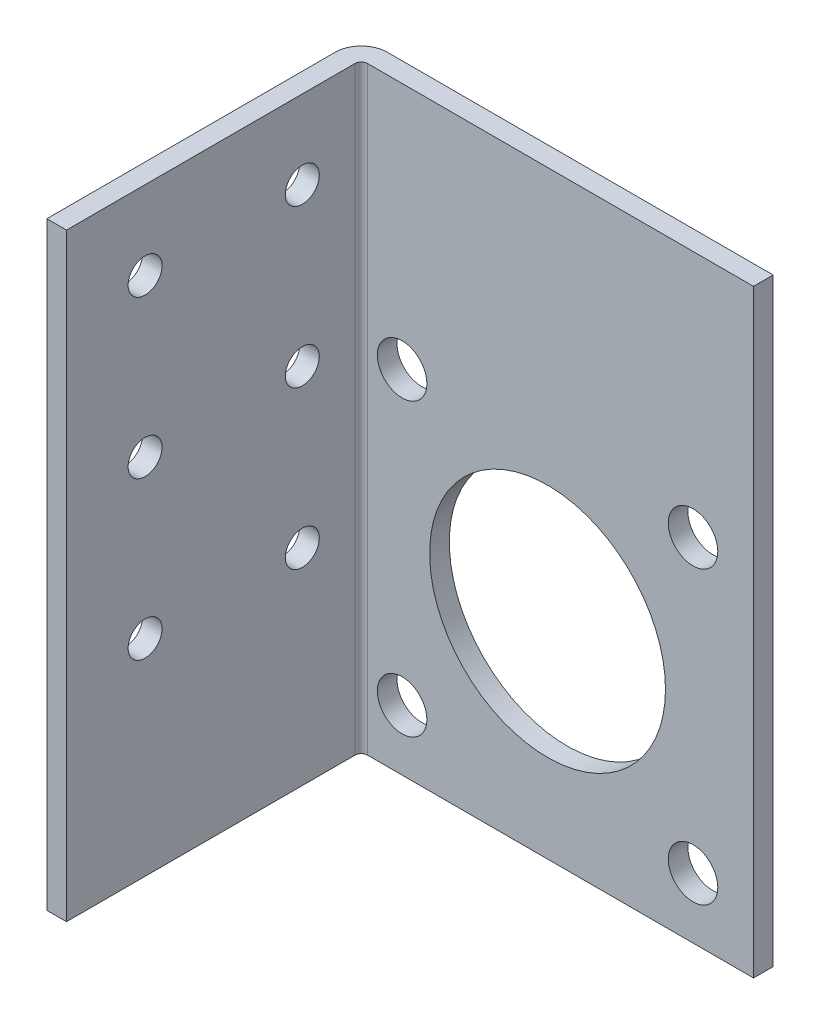
ISO-10303-21;
HEADER;
FILE_DESCRIPTION(('STEP AP214'),'2;1');
FILE_NAME('part.step','',(''),(''),'','','');
FILE_SCHEMA(('AUTOMOTIVE_DESIGN { 1 0 10303 214 1 1 1 1 }'));
ENDSEC;
DATA;
#1=APPLICATION_CONTEXT('core data for automotive mechanical design processes');
#2=APPLICATION_PROTOCOL_DEFINITION('international standard','automotive_design',2000,#1);
#3=PRODUCT_CONTEXT('',#1,'mechanical');
#4=PRODUCT('Part','Part','',(#3));
#5=PRODUCT_RELATED_PRODUCT_CATEGORY('part','',(#4));
#6=PRODUCT_DEFINITION_FORMATION('','',#4);
#7=PRODUCT_DEFINITION_CONTEXT('part definition',#1,'design');
#8=PRODUCT_DEFINITION('design','',#6,#7);
#9=PRODUCT_DEFINITION_SHAPE('','',#8);
#10=(LENGTH_UNIT() NAMED_UNIT(*) SI_UNIT(.MILLI.,.METRE.));
#11=(NAMED_UNIT(*) PLANE_ANGLE_UNIT() SI_UNIT($,.RADIAN.));
#12=(NAMED_UNIT(*) SI_UNIT($,.STERADIAN.) SOLID_ANGLE_UNIT());
#13=UNCERTAINTY_MEASURE_WITH_UNIT(LENGTH_MEASURE(1.E-05),#10,'distance_accuracy_value','');
#14=(GEOMETRIC_REPRESENTATION_CONTEXT(3) GLOBAL_UNCERTAINTY_ASSIGNED_CONTEXT((#13)) GLOBAL_UNIT_ASSIGNED_CONTEXT((#10,
#11,#12)) REPRESENTATION_CONTEXT('',''));
#15=CARTESIAN_POINT('',(0.,0.,0.));
#16=DIRECTION('',(0.,0.,1.));
#17=DIRECTION('',(1.,0.,0.));
#18=AXIS2_PLACEMENT_3D('',#15,#16,#17);
#19=CARTESIAN_POINT('',(0.,0.,3.175));
#20=DIRECTION('',(0.,0.,-1.));
#21=DIRECTION('',(-1.,0.,0.));
#22=AXIS2_PLACEMENT_3D('',#19,#20,#21);
#23=PLANE('',#22);
#24=CARTESIAN_POINT('',(-23.5,23.5,3.175));
#25=DIRECTION('',(0.,0.,1.));
#26=DIRECTION('',(1.,0.,0.));
#27=AXIS2_PLACEMENT_3D('',#24,#25,#26);
#28=CIRCLE('',#27,4.);
#29=CARTESIAN_POINT('',(-19.5,23.5,3.175));
#30=VERTEX_POINT('',#29);
#31=EDGE_CURVE('E129',#30,#30,#28,.T.);
#32=ORIENTED_EDGE('',*,*,#31,.F.);
#33=EDGE_LOOP('',(#32));
#34=FACE_BOUND('',#33,.T.);
#35=CARTESIAN_POINT('',(-23.5,-23.5,3.175));
#36=DIRECTION('',(0.,0.,1.));
#37=DIRECTION('',(1.,0.,0.));
#38=AXIS2_PLACEMENT_3D('',#35,#36,#37);
#39=CIRCLE('',#38,4.);
#40=CARTESIAN_POINT('',(-19.5,-23.5,3.175));
#41=VERTEX_POINT('',#40);
#42=EDGE_CURVE('E135',#41,#41,#39,.T.);
#43=ORIENTED_EDGE('',*,*,#42,.F.);
#44=EDGE_LOOP('',(#43));
#45=FACE_BOUND('',#44,.T.);
#46=CARTESIAN_POINT('',(23.5,-23.5,3.175));
#47=DIRECTION('',(0.,0.,1.));
#48=DIRECTION('',(1.,0.,0.));
#49=AXIS2_PLACEMENT_3D('',#46,#47,#48);
#50=CIRCLE('',#49,4.);
#51=CARTESIAN_POINT('',(27.5,-23.5,3.175));
#52=VERTEX_POINT('',#51);
#53=EDGE_CURVE('E141',#52,#52,#50,.T.);
#54=ORIENTED_EDGE('',*,*,#53,.F.);
#55=EDGE_LOOP('',(#54));
#56=FACE_BOUND('',#55,.T.);
#57=CARTESIAN_POINT('',(23.5,23.5,3.175));
#58=DIRECTION('',(0.,0.,1.));
#59=DIRECTION('',(1.,0.,0.));
#60=AXIS2_PLACEMENT_3D('',#57,#58,#59);
#61=CIRCLE('',#60,4.);
#62=CARTESIAN_POINT('',(27.5,23.5,3.175));
#63=VERTEX_POINT('',#62);
#64=EDGE_CURVE('E147',#63,#63,#61,.T.);
#65=ORIENTED_EDGE('',*,*,#64,.F.);
#66=EDGE_LOOP('',(#65));
#67=FACE_BOUND('',#66,.T.);
#68=CARTESIAN_POINT('',(0.,0.,3.175));
#69=DIRECTION('',(0.,0.,1.));
#70=DIRECTION('',(1.,0.,0.));
#71=AXIS2_PLACEMENT_3D('',#68,#69,#70);
#72=CIRCLE('',#71,19.05);
#73=CARTESIAN_POINT('',(19.05,0.,3.175));
#74=VERTEX_POINT('',#73);
#75=EDGE_CURVE('E153',#74,#74,#72,.T.);
#76=ORIENTED_EDGE('',*,*,#75,.F.);
#77=EDGE_LOOP('',(#76));
#78=FACE_BOUND('',#77,.T.);
#79=DIRECTION('',(-1.,0.,0.));
#80=VECTOR('',#79,1.);
#81=CARTESIAN_POINT('',(-33.274,63.5,3.175));
#82=LINE('',#81,#80);
#83=CARTESIAN_POINT('',(33.274,63.5,3.175));
#84=VERTEX_POINT('',#83);
#85=CARTESIAN_POINT('',(-29.083,63.5,3.175));
#86=VERTEX_POINT('',#85);
#87=EDGE_CURVE('E159',#84,#86,#82,.T.);
#88=ORIENTED_EDGE('',*,*,#87,.T.);
#89=DIRECTION('',(0.,1.,0.));
#90=VECTOR('',#89,1.);
#91=CARTESIAN_POINT('',(-29.083,-33.274,3.175));
#92=LINE('',#91,#90);
#93=CARTESIAN_POINT('',(-29.083,-33.274,3.175));
#94=VERTEX_POINT('',#93);
#95=EDGE_CURVE('E184',#86,#94,#92,.F.);
#96=ORIENTED_EDGE('',*,*,#95,.T.);
#97=DIRECTION('',(1.,0.,0.));
#98=VECTOR('',#97,1.);
#99=CARTESIAN_POINT('',(33.274,-33.274,3.175));
#100=LINE('',#99,#98);
#101=CARTESIAN_POINT('',(33.274,-33.274,3.175));
#102=VERTEX_POINT('',#101);
#103=EDGE_CURVE('E162',#94,#102,#100,.T.);
#104=ORIENTED_EDGE('',*,*,#103,.T.);
#105=DIRECTION('',(0.,1.,0.));
#106=VECTOR('',#105,1.);
#107=CARTESIAN_POINT('',(33.274,63.5,3.175));
#108=LINE('',#107,#106);
#109=EDGE_CURVE('E165',#102,#84,#108,.T.);
#110=ORIENTED_EDGE('',*,*,#109,.T.);
#111=EDGE_LOOP('',(#88,#96,#104,#110));
#112=FACE_BOUND('',#111,.T.);
#113=ADVANCED_FACE('F32',(#34,#45,#56,#67,#78,#112),#23,.F.);
#114=CARTESIAN_POINT('',(0.,0.,0.));
#115=DIRECTION('',(0.,0.,-1.));
#116=DIRECTION('',(-1.,0.,0.));
#117=AXIS2_PLACEMENT_3D('',#114,#115,#116);
#118=PLANE('',#117);
#119=DIRECTION('',(1.,0.,0.));
#120=VECTOR('',#119,1.);
#121=CARTESIAN_POINT('',(33.274,-33.274,0.));
#122=LINE('',#121,#120);
#123=CARTESIAN_POINT('',(-29.083,-33.274,0.));
#124=VERTEX_POINT('',#123);
#125=CARTESIAN_POINT('',(33.274,-33.274,0.));
#126=VERTEX_POINT('',#125);
#127=EDGE_CURVE('E169',#124,#126,#122,.T.);
#128=ORIENTED_EDGE('',*,*,#127,.F.);
#129=DIRECTION('',(0.,-1.,0.));
#130=VECTOR('',#129,1.);
#131=CARTESIAN_POINT('',(-29.083,63.5,0.));
#132=LINE('',#131,#130);
#133=CARTESIAN_POINT('',(-29.083,63.5,0.));
#134=VERTEX_POINT('',#133);
#135=EDGE_CURVE('E40',#124,#134,#132,.F.);
#136=ORIENTED_EDGE('',*,*,#135,.T.);
#137=DIRECTION('',(-1.,0.,0.));
#138=VECTOR('',#137,1.);
#139=CARTESIAN_POINT('',(-33.274,63.5,0.));
#140=LINE('',#139,#138);
#141=CARTESIAN_POINT('',(33.274,63.5,0.));
#142=VERTEX_POINT('',#141);
#143=EDGE_CURVE('E156',#142,#134,#140,.T.);
#144=ORIENTED_EDGE('',*,*,#143,.F.);
#145=DIRECTION('',(0.,1.,0.));
#146=VECTOR('',#145,1.);
#147=CARTESIAN_POINT('',(33.274,63.5,0.));
#148=LINE('',#147,#146);
#149=EDGE_CURVE('E163',#126,#142,#148,.T.);
#150=ORIENTED_EDGE('',*,*,#149,.F.);
#151=EDGE_LOOP('',(#128,#136,#144,#150));
#152=FACE_BOUND('',#151,.T.);
#153=CARTESIAN_POINT('',(-23.5,-23.5,0.));
#154=DIRECTION('',(0.,0.,1.));
#155=DIRECTION('',(1.,0.,0.));
#156=AXIS2_PLACEMENT_3D('',#153,#154,#155);
#157=CIRCLE('',#156,4.);
#158=CARTESIAN_POINT('',(-19.5,-23.5,0.));
#159=VERTEX_POINT('',#158);
#160=EDGE_CURVE('E132',#159,#159,#157,.T.);
#161=ORIENTED_EDGE('',*,*,#160,.T.);
#162=EDGE_LOOP('',(#161));
#163=FACE_BOUND('',#162,.T.);
#164=CARTESIAN_POINT('',(23.5,23.5,0.));
#165=DIRECTION('',(0.,0.,1.));
#166=DIRECTION('',(1.,0.,0.));
#167=AXIS2_PLACEMENT_3D('',#164,#165,#166);
#168=CIRCLE('',#167,4.);
#169=CARTESIAN_POINT('',(27.5,23.5,0.));
#170=VERTEX_POINT('',#169);
#171=EDGE_CURVE('E144',#170,#170,#168,.T.);
#172=ORIENTED_EDGE('',*,*,#171,.T.);
#173=EDGE_LOOP('',(#172));
#174=FACE_BOUND('',#173,.T.);
#175=CARTESIAN_POINT('',(0.,0.,0.));
#176=DIRECTION('',(0.,0.,1.));
#177=DIRECTION('',(1.,0.,0.));
#178=AXIS2_PLACEMENT_3D('',#175,#176,#177);
#179=CIRCLE('',#178,19.05);
#180=CARTESIAN_POINT('',(19.05,0.,0.));
#181=VERTEX_POINT('',#180);
#182=EDGE_CURVE('E150',#181,#181,#179,.T.);
#183=ORIENTED_EDGE('',*,*,#182,.T.);
#184=EDGE_LOOP('',(#183));
#185=FACE_BOUND('',#184,.T.);
#186=CARTESIAN_POINT('',(23.5,-23.5,0.));
#187=DIRECTION('',(0.,0.,1.));
#188=DIRECTION('',(1.,0.,0.));
#189=AXIS2_PLACEMENT_3D('',#186,#187,#188);
#190=CIRCLE('',#189,4.);
#191=CARTESIAN_POINT('',(27.5,-23.5,0.));
#192=VERTEX_POINT('',#191);
#193=EDGE_CURVE('E138',#192,#192,#190,.T.);
#194=ORIENTED_EDGE('',*,*,#193,.T.);
#195=EDGE_LOOP('',(#194));
#196=FACE_BOUND('',#195,.T.);
#197=CARTESIAN_POINT('',(-23.5,23.5,0.));
#198=DIRECTION('',(0.,0.,1.));
#199=DIRECTION('',(1.,0.,0.));
#200=AXIS2_PLACEMENT_3D('',#197,#198,#199);
#201=CIRCLE('',#200,4.);
#202=CARTESIAN_POINT('',(-19.5,23.5,0.));
#203=VERTEX_POINT('',#202);
#204=EDGE_CURVE('E127',#203,#203,#201,.T.);
#205=ORIENTED_EDGE('',*,*,#204,.T.);
#206=EDGE_LOOP('',(#205));
#207=FACE_BOUND('',#206,.T.);
#208=ADVANCED_FACE('F203',(#152,#163,#174,#185,#196,#207),#118,.T.);
#209=CARTESIAN_POINT('',(-33.274,63.5,3.175));
#210=DIRECTION('',(0.,-1.,0.));
#211=DIRECTION('',(0.,0.,-1.));
#212=AXIS2_PLACEMENT_3D('',#209,#210,#211);
#213=PLANE('',#212);
#214=ORIENTED_EDGE('',*,*,#143,.T.);
#215=CARTESIAN_POINT('',(-29.083,63.5,4.191));
#216=DIRECTION('',(0.,-1.,0.));
#217=DIRECTION('',(0.,0.,-1.));
#218=AXIS2_PLACEMENT_3D('',#215,#216,#217);
#219=CIRCLE('',#218,4.191);
#220=CARTESIAN_POINT('',(-33.274,63.5,4.191));
#221=VERTEX_POINT('',#220);
#222=EDGE_CURVE('E11',#134,#221,#219,.F.);
#223=ORIENTED_EDGE('',*,*,#222,.T.);
#224=DIRECTION('',(0.,0.,-1.));
#225=VECTOR('',#224,1.);
#226=CARTESIAN_POINT('',(-33.274,63.5,3.175));
#227=LINE('',#226,#225);
#228=CARTESIAN_POINT('',(-33.274,63.5,50.8));
#229=VERTEX_POINT('',#228);
#230=EDGE_CURVE('E179',#229,#221,#227,.T.);
#231=ORIENTED_EDGE('',*,*,#230,.F.);
#232=DIRECTION('',(-1.,0.,0.));
#233=VECTOR('',#232,1.);
#234=CARTESIAN_POINT('',(-30.099,63.5,50.8));
#235=LINE('',#234,#233);
#236=CARTESIAN_POINT('',(-30.099,63.5,50.8));
#237=VERTEX_POINT('',#236);
#238=EDGE_CURVE('E116',#237,#229,#235,.T.);
#239=ORIENTED_EDGE('',*,*,#238,.F.);
#240=DIRECTION('',(0.,0.,-1.));
#241=VECTOR('',#240,1.);
#242=CARTESIAN_POINT('',(-30.099,63.5,0.));
#243=LINE('',#242,#241);
#244=CARTESIAN_POINT('',(-30.099,63.5,4.191));
#245=VERTEX_POINT('',#244);
#246=EDGE_CURVE('E117',#237,#245,#243,.T.);
#247=ORIENTED_EDGE('',*,*,#246,.T.);
#248=CARTESIAN_POINT('',(-29.083,63.5,4.191));
#249=DIRECTION('',(0.,-1.,0.));
#250=DIRECTION('',(0.,0.,-1.));
#251=AXIS2_PLACEMENT_3D('',#248,#249,#250);
#252=CIRCLE('',#251,1.016);
#253=EDGE_CURVE('E186',#245,#86,#252,.T.);
#254=ORIENTED_EDGE('',*,*,#253,.T.);
#255=ORIENTED_EDGE('',*,*,#87,.F.);
#256=DIRECTION('',(0.,0.,-1.));
#257=VECTOR('',#256,1.);
#258=CARTESIAN_POINT('',(33.274,63.5,3.175));
#259=LINE('',#258,#257);
#260=EDGE_CURVE('E167',#84,#142,#259,.T.);
#261=ORIENTED_EDGE('',*,*,#260,.T.);
#262=EDGE_LOOP('',(#214,#223,#231,#239,#247,#254,#255,#261));
#263=FACE_BOUND('',#262,.T.);
#264=ADVANCED_FACE('F199',(#263),#213,.F.);
#265=CARTESIAN_POINT('',(-33.274,-33.274,3.175));
#266=DIRECTION('',(1.,0.,0.));
#267=DIRECTION('',(0.,1.,0.));
#268=AXIS2_PLACEMENT_3D('',#265,#266,#267);
#269=PLANE('',#268);
#270=ORIENTED_EDGE('',*,*,#230,.T.);
#271=DIRECTION('',(0.,-1.,0.));
#272=VECTOR('',#271,1.);
#273=CARTESIAN_POINT('',(-33.274,-33.274,4.191));
#274=LINE('',#273,#272);
#275=CARTESIAN_POINT('',(-33.274,-33.274,4.191));
#276=VERTEX_POINT('',#275);
#277=EDGE_CURVE('E189',#221,#276,#274,.T.);
#278=ORIENTED_EDGE('',*,*,#277,.T.);
#279=DIRECTION('',(0.,0.,-1.));
#280=VECTOR('',#279,1.);
#281=CARTESIAN_POINT('',(-33.274,-33.274,3.175));
#282=LINE('',#281,#280);
#283=CARTESIAN_POINT('',(-33.274,-33.274,50.8));
#284=VERTEX_POINT('',#283);
#285=EDGE_CURVE('E177',#284,#276,#282,.T.);
#286=ORIENTED_EDGE('',*,*,#285,.F.);
#287=DIRECTION('',(0.,1.,0.));
#288=VECTOR('',#287,1.);
#289=CARTESIAN_POINT('',(-33.274,63.5,50.8));
#290=LINE('',#289,#288);
#291=EDGE_CURVE('E108',#284,#229,#290,.T.);
#292=ORIENTED_EDGE('',*,*,#291,.T.);
#293=EDGE_LOOP('',(#270,#278,#286,#292));
#294=FACE_BOUND('',#293,.T.);
#295=CARTESIAN_POINT('',(-33.274,50.8,38.1));
#296=DIRECTION('',(-1.,0.,0.));
#297=DIRECTION('',(0.,-1.,0.));
#298=AXIS2_PLACEMENT_3D('',#295,#296,#297);
#299=CIRCLE('',#298,2.7432);
#300=CARTESIAN_POINT('',(-33.274,48.0568,38.1));
#301=VERTEX_POINT('',#300);
#302=EDGE_CURVE('E458',#301,#301,#299,.T.);
#303=ORIENTED_EDGE('',*,*,#302,.F.);
#304=EDGE_LOOP('',(#303));
#305=FACE_BOUND('',#304,.T.);
#306=CARTESIAN_POINT('',(-33.274,50.8,12.7));
#307=DIRECTION('',(-1.,0.,0.));
#308=DIRECTION('',(0.,-1.,0.));
#309=AXIS2_PLACEMENT_3D('',#306,#307,#308);
#310=CIRCLE('',#309,2.7432);
#311=CARTESIAN_POINT('',(-33.274,48.0568,12.7));
#312=VERTEX_POINT('',#311);
#313=EDGE_CURVE('E462',#312,#312,#310,.T.);
#314=ORIENTED_EDGE('',*,*,#313,.F.);
#315=EDGE_LOOP('',(#314));
#316=FACE_BOUND('',#315,.T.);
#317=CARTESIAN_POINT('',(-33.274,25.4,38.1));
#318=DIRECTION('',(-1.,0.,0.));
#319=DIRECTION('',(0.,-1.,0.));
#320=AXIS2_PLACEMENT_3D('',#317,#318,#319);
#321=CIRCLE('',#320,2.7432);
#322=CARTESIAN_POINT('',(-33.274,22.6568,38.1));
#323=VERTEX_POINT('',#322);
#324=EDGE_CURVE('E466',#323,#323,#321,.T.);
#325=ORIENTED_EDGE('',*,*,#324,.F.);
#326=EDGE_LOOP('',(#325));
#327=FACE_BOUND('',#326,.T.);
#328=CARTESIAN_POINT('',(-33.274,25.4,12.7));
#329=DIRECTION('',(-1.,0.,0.));
#330=DIRECTION('',(0.,-1.,0.));
#331=AXIS2_PLACEMENT_3D('',#328,#329,#330);
#332=CIRCLE('',#331,2.7432);
#333=CARTESIAN_POINT('',(-33.274,22.6568,12.7));
#334=VERTEX_POINT('',#333);
#335=EDGE_CURVE('E470',#334,#334,#332,.T.);
#336=ORIENTED_EDGE('',*,*,#335,.F.);
#337=EDGE_LOOP('',(#336));
#338=FACE_BOUND('',#337,.T.);
#339=CARTESIAN_POINT('',(-33.274,0.,38.1));
#340=DIRECTION('',(-1.,0.,0.));
#341=DIRECTION('',(0.,-1.,0.));
#342=AXIS2_PLACEMENT_3D('',#339,#340,#341);
#343=CIRCLE('',#342,2.7432);
#344=CARTESIAN_POINT('',(-33.274,-2.7432,38.1));
#345=VERTEX_POINT('',#344);
#346=EDGE_CURVE('E474',#345,#345,#343,.T.);
#347=ORIENTED_EDGE('',*,*,#346,.F.);
#348=EDGE_LOOP('',(#347));
#349=FACE_BOUND('',#348,.T.);
#350=CARTESIAN_POINT('',(-33.274,0.,12.7));
#351=DIRECTION('',(-1.,0.,0.));
#352=DIRECTION('',(0.,-1.,0.));
#353=AXIS2_PLACEMENT_3D('',#350,#351,#352);
#354=CIRCLE('',#353,2.7432);
#355=CARTESIAN_POINT('',(-33.274,-2.7432,12.7));
#356=VERTEX_POINT('',#355);
#357=EDGE_CURVE('E478',#356,#356,#354,.T.);
#358=ORIENTED_EDGE('',*,*,#357,.F.);
#359=EDGE_LOOP('',(#358));
#360=FACE_BOUND('',#359,.T.);
#361=ADVANCED_FACE('F194',(#294,#305,#316,#327,#338,#349,#360),#269,.F.);
#362=CARTESIAN_POINT('',(33.274,-33.274,3.175));
#363=DIRECTION('',(0.,1.,0.));
#364=DIRECTION('',(0.,0.,1.));
#365=AXIS2_PLACEMENT_3D('',#362,#363,#364);
#366=PLANE('',#365);
#367=ORIENTED_EDGE('',*,*,#285,.T.);
#368=CARTESIAN_POINT('',(-29.083,-33.274,4.191));
#369=DIRECTION('',(0.,1.,0.));
#370=DIRECTION('',(0.,0.,1.));
#371=AXIS2_PLACEMENT_3D('',#368,#369,#370);
#372=CIRCLE('',#371,4.191);
#373=EDGE_CURVE('E54',#276,#124,#372,.F.);
#374=ORIENTED_EDGE('',*,*,#373,.T.);
#375=ORIENTED_EDGE('',*,*,#127,.T.);
#376=DIRECTION('',(0.,0.,-1.));
#377=VECTOR('',#376,1.);
#378=CARTESIAN_POINT('',(33.274,-33.274,3.175));
#379=LINE('',#378,#377);
#380=EDGE_CURVE('E174',#102,#126,#379,.T.);
#381=ORIENTED_EDGE('',*,*,#380,.F.);
#382=ORIENTED_EDGE('',*,*,#103,.F.);
#383=CARTESIAN_POINT('',(-29.083,-33.274,4.191));
#384=DIRECTION('',(0.,1.,0.));
#385=DIRECTION('',(0.,0.,1.));
#386=AXIS2_PLACEMENT_3D('',#383,#384,#385);
#387=CIRCLE('',#386,1.016);
#388=CARTESIAN_POINT('',(-30.099,-33.274,4.191));
#389=VERTEX_POINT('',#388);
#390=EDGE_CURVE('E102',#94,#389,#387,.T.);
#391=ORIENTED_EDGE('',*,*,#390,.T.);
#392=DIRECTION('',(0.,0.,1.));
#393=VECTOR('',#392,1.);
#394=CARTESIAN_POINT('',(-30.099,-33.274,0.));
#395=LINE('',#394,#393);
#396=CARTESIAN_POINT('',(-30.099,-33.274,50.8));
#397=VERTEX_POINT('',#396);
#398=EDGE_CURVE('E95',#389,#397,#395,.T.);
#399=ORIENTED_EDGE('',*,*,#398,.T.);
#400=DIRECTION('',(-1.,0.,0.));
#401=VECTOR('',#400,1.);
#402=CARTESIAN_POINT('',(-30.099,-33.274,50.8));
#403=LINE('',#402,#401);
#404=EDGE_CURVE('E98',#397,#284,#403,.T.);
#405=ORIENTED_EDGE('',*,*,#404,.T.);
#406=EDGE_LOOP('',(#367,#374,#375,#381,#382,#391,#399,#405));
#407=FACE_BOUND('',#406,.T.);
#408=ADVANCED_FACE('F97',(#407),#366,.F.);
#409=CARTESIAN_POINT('',(33.274,63.5,3.175));
#410=DIRECTION('',(-1.,0.,0.));
#411=DIRECTION('',(0.,0.,1.));
#412=AXIS2_PLACEMENT_3D('',#409,#410,#411);
#413=PLANE('',#412);
#414=ORIENTED_EDGE('',*,*,#149,.T.);
#415=ORIENTED_EDGE('',*,*,#260,.F.);
#416=ORIENTED_EDGE('',*,*,#109,.F.);
#417=ORIENTED_EDGE('',*,*,#380,.T.);
#418=EDGE_LOOP('',(#414,#415,#416,#417));
#419=FACE_BOUND('',#418,.T.);
#420=ADVANCED_FACE('F206',(#419),#413,.F.);
#421=CARTESIAN_POINT('',(0.,0.,3.175));
#422=DIRECTION('',(0.,0.,-1.));
#423=DIRECTION('',(-1.,0.,0.));
#424=AXIS2_PLACEMENT_3D('',#421,#422,#423);
#425=CYLINDRICAL_SURFACE('',#424,19.05);
#426=ORIENTED_EDGE('',*,*,#75,.T.);
#427=EDGE_LOOP('',(#426));
#428=FACE_BOUND('',#427,.T.);
#429=ORIENTED_EDGE('',*,*,#182,.F.);
#430=EDGE_LOOP('',(#429));
#431=FACE_BOUND('',#430,.T.);
#432=ADVANCED_FACE('F223',(#428,#431),#425,.F.);
#433=CARTESIAN_POINT('',(23.5,23.5,3.175));
#434=DIRECTION('',(0.,0.,-1.));
#435=DIRECTION('',(-1.,0.,0.));
#436=AXIS2_PLACEMENT_3D('',#433,#434,#435);
#437=CYLINDRICAL_SURFACE('',#436,4.);
#438=ORIENTED_EDGE('',*,*,#64,.T.);
#439=EDGE_LOOP('',(#438));
#440=FACE_BOUND('',#439,.T.);
#441=ORIENTED_EDGE('',*,*,#171,.F.);
#442=EDGE_LOOP('',(#441));
#443=FACE_BOUND('',#442,.T.);
#444=ADVANCED_FACE('F281',(#440,#443),#437,.F.);
#445=CARTESIAN_POINT('',(23.5,-23.5,3.175));
#446=DIRECTION('',(0.,0.,-1.));
#447=DIRECTION('',(-1.,0.,0.));
#448=AXIS2_PLACEMENT_3D('',#445,#446,#447);
#449=CYLINDRICAL_SURFACE('',#448,4.);
#450=ORIENTED_EDGE('',*,*,#53,.T.);
#451=EDGE_LOOP('',(#450));
#452=FACE_BOUND('',#451,.T.);
#453=ORIENTED_EDGE('',*,*,#193,.F.);
#454=EDGE_LOOP('',(#453));
#455=FACE_BOUND('',#454,.T.);
#456=ADVANCED_FACE('F278',(#452,#455),#449,.F.);
#457=CARTESIAN_POINT('',(-23.5,-23.5,3.175));
#458=DIRECTION('',(0.,0.,-1.));
#459=DIRECTION('',(-1.,0.,0.));
#460=AXIS2_PLACEMENT_3D('',#457,#458,#459);
#461=CYLINDRICAL_SURFACE('',#460,4.);
#462=ORIENTED_EDGE('',*,*,#42,.T.);
#463=EDGE_LOOP('',(#462));
#464=FACE_BOUND('',#463,.T.);
#465=ORIENTED_EDGE('',*,*,#160,.F.);
#466=EDGE_LOOP('',(#465));
#467=FACE_BOUND('',#466,.T.);
#468=ADVANCED_FACE('F274',(#464,#467),#461,.F.);
#469=CARTESIAN_POINT('',(-23.5,23.5,3.175));
#470=DIRECTION('',(0.,0.,-1.));
#471=DIRECTION('',(-1.,0.,0.));
#472=AXIS2_PLACEMENT_3D('',#469,#470,#471);
#473=CYLINDRICAL_SURFACE('',#472,4.);
#474=ORIENTED_EDGE('',*,*,#31,.T.);
#475=EDGE_LOOP('',(#474));
#476=FACE_BOUND('',#475,.T.);
#477=ORIENTED_EDGE('',*,*,#204,.F.);
#478=EDGE_LOOP('',(#477));
#479=FACE_BOUND('',#478,.T.);
#480=ADVANCED_FACE('F268',(#476,#479),#473,.F.);
#481=CARTESIAN_POINT('',(-30.099,0.,0.));
#482=DIRECTION('',(-1.,0.,0.));
#483=DIRECTION('',(0.,-1.,0.));
#484=AXIS2_PLACEMENT_3D('',#481,#482,#483);
#485=PLANE('',#484);
#486=CARTESIAN_POINT('',(-30.099,0.,12.7));
#487=DIRECTION('',(-1.,0.,0.));
#488=DIRECTION('',(0.,-1.,0.));
#489=AXIS2_PLACEMENT_3D('',#486,#487,#488);
#490=CIRCLE('',#489,2.7432);
#491=CARTESIAN_POINT('',(-30.099,-2.7432,12.7));
#492=VERTEX_POINT('',#491);
#493=EDGE_CURVE('E439',#492,#492,#490,.T.);
#494=ORIENTED_EDGE('',*,*,#493,.T.);
#495=EDGE_LOOP('',(#494));
#496=FACE_BOUND('',#495,.T.);
#497=CARTESIAN_POINT('',(-30.099,0.,38.1));
#498=DIRECTION('',(-1.,0.,0.));
#499=DIRECTION('',(0.,-1.,0.));
#500=AXIS2_PLACEMENT_3D('',#497,#498,#499);
#501=CIRCLE('',#500,2.7432);
#502=CARTESIAN_POINT('',(-30.099,-2.7432,38.1));
#503=VERTEX_POINT('',#502);
#504=EDGE_CURVE('E443',#503,#503,#501,.T.);
#505=ORIENTED_EDGE('',*,*,#504,.T.);
#506=EDGE_LOOP('',(#505));
#507=FACE_BOUND('',#506,.T.);
#508=CARTESIAN_POINT('',(-30.099,25.4,12.7));
#509=DIRECTION('',(-1.,0.,0.));
#510=DIRECTION('',(0.,-1.,0.));
#511=AXIS2_PLACEMENT_3D('',#508,#509,#510);
#512=CIRCLE('',#511,2.7432);
#513=CARTESIAN_POINT('',(-30.099,22.6568,12.7));
#514=VERTEX_POINT('',#513);
#515=EDGE_CURVE('E447',#514,#514,#512,.T.);
#516=ORIENTED_EDGE('',*,*,#515,.T.);
#517=EDGE_LOOP('',(#516));
#518=FACE_BOUND('',#517,.T.);
#519=CARTESIAN_POINT('',(-30.099,25.4,38.1));
#520=DIRECTION('',(-1.,0.,0.));
#521=DIRECTION('',(0.,-1.,0.));
#522=AXIS2_PLACEMENT_3D('',#519,#520,#521);
#523=CIRCLE('',#522,2.7432);
#524=CARTESIAN_POINT('',(-30.099,22.6568,38.1));
#525=VERTEX_POINT('',#524);
#526=EDGE_CURVE('E451',#525,#525,#523,.T.);
#527=ORIENTED_EDGE('',*,*,#526,.T.);
#528=EDGE_LOOP('',(#527));
#529=FACE_BOUND('',#528,.T.);
#530=CARTESIAN_POINT('',(-30.099,50.8,12.7));
#531=DIRECTION('',(-1.,0.,0.));
#532=DIRECTION('',(0.,-1.,0.));
#533=AXIS2_PLACEMENT_3D('',#530,#531,#532);
#534=CIRCLE('',#533,2.7432);
#535=CARTESIAN_POINT('',(-30.099,48.0568,12.7));
#536=VERTEX_POINT('',#535);
#537=EDGE_CURVE('E455',#536,#536,#534,.T.);
#538=ORIENTED_EDGE('',*,*,#537,.T.);
#539=EDGE_LOOP('',(#538));
#540=FACE_BOUND('',#539,.T.);
#541=CARTESIAN_POINT('',(-30.099,50.8,38.1));
#542=DIRECTION('',(-1.,0.,0.));
#543=DIRECTION('',(0.,-1.,0.));
#544=AXIS2_PLACEMENT_3D('',#541,#542,#543);
#545=CIRCLE('',#544,2.7432);
#546=CARTESIAN_POINT('',(-30.099,48.0568,38.1));
#547=VERTEX_POINT('',#546);
#548=EDGE_CURVE('E126',#547,#547,#545,.T.);
#549=ORIENTED_EDGE('',*,*,#548,.T.);
#550=EDGE_LOOP('',(#549));
#551=FACE_BOUND('',#550,.T.);
#552=ORIENTED_EDGE('',*,*,#398,.F.);
#553=DIRECTION('',(0.,1.,0.));
#554=VECTOR('',#553,1.);
#555=CARTESIAN_POINT('',(-30.099,63.5,4.191));
#556=LINE('',#555,#554);
#557=EDGE_CURVE('E182',#389,#245,#556,.T.);
#558=ORIENTED_EDGE('',*,*,#557,.T.);
#559=ORIENTED_EDGE('',*,*,#246,.F.);
#560=DIRECTION('',(0.,1.,0.));
#561=VECTOR('',#560,1.);
#562=CARTESIAN_POINT('',(-30.099,63.5,50.8));
#563=LINE('',#562,#561);
#564=EDGE_CURVE('E107',#397,#237,#563,.T.);
#565=ORIENTED_EDGE('',*,*,#564,.F.);
#566=EDGE_LOOP('',(#552,#558,#559,#565));
#567=FACE_BOUND('',#566,.T.);
#568=ADVANCED_FACE('F119',(#496,#507,#518,#529,#540,#551,#567),#485,.F.);
#569=CARTESIAN_POINT('',(-30.099,63.5,50.8));
#570=DIRECTION('',(0.,0.,1.));
#571=DIRECTION('',(0.,-1.,0.));
#572=AXIS2_PLACEMENT_3D('',#569,#570,#571);
#573=PLANE('',#572);
#574=ORIENTED_EDGE('',*,*,#291,.F.);
#575=ORIENTED_EDGE('',*,*,#404,.F.);
#576=ORIENTED_EDGE('',*,*,#564,.T.);
#577=ORIENTED_EDGE('',*,*,#238,.T.);
#578=EDGE_LOOP('',(#574,#575,#576,#577));
#579=FACE_BOUND('',#578,.T.);
#580=ADVANCED_FACE('F112',(#579),#573,.T.);
#581=CARTESIAN_POINT('',(-30.099,50.8,38.1));
#582=DIRECTION('',(-1.,0.,0.));
#583=DIRECTION('',(0.,-1.,0.));
#584=AXIS2_PLACEMENT_3D('',#581,#582,#583);
#585=CYLINDRICAL_SURFACE('',#584,2.7432);
#586=ORIENTED_EDGE('',*,*,#548,.F.);
#587=EDGE_LOOP('',(#586));
#588=FACE_BOUND('',#587,.T.);
#589=ORIENTED_EDGE('',*,*,#302,.T.);
#590=EDGE_LOOP('',(#589));
#591=FACE_BOUND('',#590,.T.);
#592=ADVANCED_FACE('F261',(#588,#591),#585,.F.);
#593=CARTESIAN_POINT('',(-30.099,50.8,12.7));
#594=DIRECTION('',(-1.,0.,0.));
#595=DIRECTION('',(0.,-1.,0.));
#596=AXIS2_PLACEMENT_3D('',#593,#594,#595);
#597=CYLINDRICAL_SURFACE('',#596,2.7432);
#598=ORIENTED_EDGE('',*,*,#537,.F.);
#599=EDGE_LOOP('',(#598));
#600=FACE_BOUND('',#599,.T.);
#601=ORIENTED_EDGE('',*,*,#313,.T.);
#602=EDGE_LOOP('',(#601));
#603=FACE_BOUND('',#602,.T.);
#604=ADVANCED_FACE('F257',(#600,#603),#597,.F.);
#605=CARTESIAN_POINT('',(-30.099,25.4,38.1));
#606=DIRECTION('',(-1.,0.,0.));
#607=DIRECTION('',(0.,-1.,0.));
#608=AXIS2_PLACEMENT_3D('',#605,#606,#607);
#609=CYLINDRICAL_SURFACE('',#608,2.7432);
#610=ORIENTED_EDGE('',*,*,#526,.F.);
#611=EDGE_LOOP('',(#610));
#612=FACE_BOUND('',#611,.T.);
#613=ORIENTED_EDGE('',*,*,#324,.T.);
#614=EDGE_LOOP('',(#613));
#615=FACE_BOUND('',#614,.T.);
#616=ADVANCED_FACE('F253',(#612,#615),#609,.F.);
#617=CARTESIAN_POINT('',(-30.099,25.4,12.7));
#618=DIRECTION('',(-1.,0.,0.));
#619=DIRECTION('',(0.,-1.,0.));
#620=AXIS2_PLACEMENT_3D('',#617,#618,#619);
#621=CYLINDRICAL_SURFACE('',#620,2.7432);
#622=ORIENTED_EDGE('',*,*,#515,.F.);
#623=EDGE_LOOP('',(#622));
#624=FACE_BOUND('',#623,.T.);
#625=ORIENTED_EDGE('',*,*,#335,.T.);
#626=EDGE_LOOP('',(#625));
#627=FACE_BOUND('',#626,.T.);
#628=ADVANCED_FACE('F245',(#624,#627),#621,.F.);
#629=CARTESIAN_POINT('',(-30.099,0.,38.1));
#630=DIRECTION('',(-1.,0.,0.));
#631=DIRECTION('',(0.,-1.,0.));
#632=AXIS2_PLACEMENT_3D('',#629,#630,#631);
#633=CYLINDRICAL_SURFACE('',#632,2.7432);
#634=ORIENTED_EDGE('',*,*,#504,.F.);
#635=EDGE_LOOP('',(#634));
#636=FACE_BOUND('',#635,.T.);
#637=ORIENTED_EDGE('',*,*,#346,.T.);
#638=EDGE_LOOP('',(#637));
#639=FACE_BOUND('',#638,.T.);
#640=ADVANCED_FACE('F239',(#636,#639),#633,.F.);
#641=CARTESIAN_POINT('',(-30.099,0.,12.7));
#642=DIRECTION('',(-1.,0.,0.));
#643=DIRECTION('',(0.,-1.,0.));
#644=AXIS2_PLACEMENT_3D('',#641,#642,#643);
#645=CYLINDRICAL_SURFACE('',#644,2.7432);
#646=ORIENTED_EDGE('',*,*,#493,.F.);
#647=EDGE_LOOP('',(#646));
#648=FACE_BOUND('',#647,.T.);
#649=ORIENTED_EDGE('',*,*,#357,.T.);
#650=EDGE_LOOP('',(#649));
#651=FACE_BOUND('',#650,.T.);
#652=ADVANCED_FACE('F234',(#648,#651),#645,.F.);
#653=CARTESIAN_POINT('',(-29.083,0.,4.191));
#654=DIRECTION('',(0.,-1.,0.));
#655=DIRECTION('',(1.,0.,0.));
#656=AXIS2_PLACEMENT_3D('',#653,#654,#655);
#657=CYLINDRICAL_SURFACE('',#656,1.016);
#658=ORIENTED_EDGE('',*,*,#390,.F.);
#659=ORIENTED_EDGE('',*,*,#95,.F.);
#660=ORIENTED_EDGE('',*,*,#253,.F.);
#661=ORIENTED_EDGE('',*,*,#557,.F.);
#662=EDGE_LOOP('',(#658,#659,#660,#661));
#663=FACE_BOUND('',#662,.T.);
#664=ADVANCED_FACE('F212',(#663),#657,.F.);
#665=CARTESIAN_POINT('',(-29.083,-33.274,4.191));
#666=DIRECTION('',(0.,1.,0.));
#667=DIRECTION('',(-1.,0.,0.));
#668=AXIS2_PLACEMENT_3D('',#665,#666,#667);
#669=CYLINDRICAL_SURFACE('',#668,4.191);
#670=ORIENTED_EDGE('',*,*,#222,.F.);
#671=ORIENTED_EDGE('',*,*,#135,.F.);
#672=ORIENTED_EDGE('',*,*,#373,.F.);
#673=ORIENTED_EDGE('',*,*,#277,.F.);
#674=EDGE_LOOP('',(#670,#671,#672,#673));
#675=FACE_BOUND('',#674,.T.);
#676=ADVANCED_FACE('F34',(#675),#669,.T.);
#677=CLOSED_SHELL('',(#113,#208,#264,#361,#408,#420,#432,#444,#456,#468,#480,#568,#580,#592,
#604,#616,#628,#640,#652,#664,#676));
#678=MANIFOLD_SOLID_BREP('B2',#677);
#679=ADVANCED_BREP_SHAPE_REPRESENTATION('',(#18,#678),#14);
#680=SHAPE_DEFINITION_REPRESENTATION(#9,#679);
ENDSEC;
END-ISO-10303-21;
